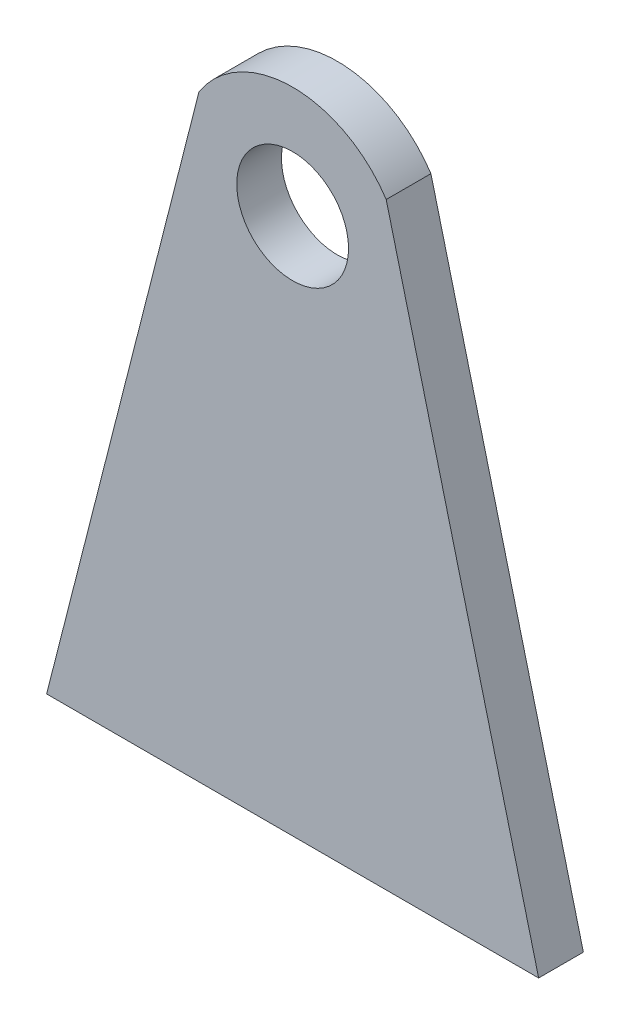
ISO-10303-21;
HEADER;
FILE_DESCRIPTION(('STEP AP214'),'2;1');
FILE_NAME('part.step','',(''),(''),'','','');
FILE_SCHEMA(('AUTOMOTIVE_DESIGN { 1 0 10303 214 1 1 1 1 }'));
ENDSEC;
DATA;
#1=APPLICATION_CONTEXT('core data for automotive mechanical design processes');
#2=APPLICATION_PROTOCOL_DEFINITION('international standard','automotive_design',2000,#1);
#3=PRODUCT_CONTEXT('',#1,'mechanical');
#4=PRODUCT('Part','Part','',(#3));
#5=PRODUCT_RELATED_PRODUCT_CATEGORY('part','',(#4));
#6=PRODUCT_DEFINITION_FORMATION('','',#4);
#7=PRODUCT_DEFINITION_CONTEXT('part definition',#1,'design');
#8=PRODUCT_DEFINITION('design','',#6,#7);
#9=PRODUCT_DEFINITION_SHAPE('','',#8);
#10=(LENGTH_UNIT() NAMED_UNIT(*) SI_UNIT(.MILLI.,.METRE.));
#11=(NAMED_UNIT(*) PLANE_ANGLE_UNIT() SI_UNIT($,.RADIAN.));
#12=(NAMED_UNIT(*) SI_UNIT($,.STERADIAN.) SOLID_ANGLE_UNIT());
#13=UNCERTAINTY_MEASURE_WITH_UNIT(LENGTH_MEASURE(1.E-05),#10,'distance_accuracy_value','');
#14=(GEOMETRIC_REPRESENTATION_CONTEXT(3) GLOBAL_UNCERTAINTY_ASSIGNED_CONTEXT((#13)) GLOBAL_UNIT_ASSIGNED_CONTEXT((#10,
#11,#12)) REPRESENTATION_CONTEXT('',''));
#15=CARTESIAN_POINT('',(0.,0.,0.));
#16=DIRECTION('',(0.,0.,1.));
#17=DIRECTION('',(1.,0.,0.));
#18=AXIS2_PLACEMENT_3D('',#15,#16,#17);
#19=CARTESIAN_POINT('',(110.,-145.,20.));
#20=DIRECTION('',(-0.969008767260909,-0.247026332546743,0.));
#21=DIRECTION('',(0.247026332546743,-0.969008767260909,0.));
#22=AXIS2_PLACEMENT_3D('',#19,#20,#21);
#23=PLANE('',#22);
#24=DIRECTION('',(-0.247026332546743,0.969008767260909,0.));
#25=VECTOR('',#24,1.);
#26=CARTESIAN_POINT('',(110.,-145.,0.));
#27=LINE('',#26,#25);
#28=CARTESIAN_POINT('',(110.,-145.,0.));
#29=VERTEX_POINT('',#28);
#30=CARTESIAN_POINT('',(41.8380805064685,122.378367729546,0.));
#31=VERTEX_POINT('',#30);
#32=EDGE_CURVE('E100',#29,#31,#27,.T.);
#33=ORIENTED_EDGE('',*,*,#32,.T.);
#34=DIRECTION('',(0.,0.,-1.));
#35=VECTOR('',#34,1.);
#36=CARTESIAN_POINT('',(41.8380805064685,122.378367729546,20.));
#37=LINE('',#36,#35);
#38=CARTESIAN_POINT('',(41.8380805064685,122.378367729546,20.));
#39=VERTEX_POINT('',#38);
#40=EDGE_CURVE('E11',#39,#31,#37,.T.);
#41=ORIENTED_EDGE('',*,*,#40,.F.);
#42=DIRECTION('',(-0.247026332546743,0.969008767260909,0.));
#43=VECTOR('',#42,1.);
#44=CARTESIAN_POINT('',(110.,-145.,20.));
#45=LINE('',#44,#43);
#46=CARTESIAN_POINT('',(110.,-145.,20.));
#47=VERTEX_POINT('',#46);
#48=EDGE_CURVE('E88',#47,#39,#45,.T.);
#49=ORIENTED_EDGE('',*,*,#48,.F.);
#50=DIRECTION('',(0.,0.,-1.));
#51=VECTOR('',#50,1.);
#52=CARTESIAN_POINT('',(110.,-145.,20.));
#53=LINE('',#52,#51);
#54=EDGE_CURVE('E96',#47,#29,#53,.T.);
#55=ORIENTED_EDGE('',*,*,#54,.T.);
#56=EDGE_LOOP('',(#33,#41,#49,#55));
#57=FACE_BOUND('',#56,.T.);
#58=ADVANCED_FACE('F37',(#57),#23,.F.);
#59=CARTESIAN_POINT('',(0.,95.,20.));
#60=DIRECTION('',(0.,0.,-1.));
#61=DIRECTION('',(-1.,0.,0.));
#62=AXIS2_PLACEMENT_3D('',#59,#60,#61);
#63=CYLINDRICAL_SURFACE('',#62,50.);
#64=CARTESIAN_POINT('',(0.,95.,0.));
#65=DIRECTION('',(0.,0.,1.));
#66=DIRECTION('',(1.,0.,0.));
#67=AXIS2_PLACEMENT_3D('',#64,#65,#66);
#68=CIRCLE('',#67,50.);
#69=CARTESIAN_POINT('',(-41.8380805064684,122.378367729546,0.));
#70=VERTEX_POINT('',#69);
#71=EDGE_CURVE('E92',#31,#70,#68,.T.);
#72=ORIENTED_EDGE('',*,*,#71,.T.);
#73=DIRECTION('',(0.,0.,-1.));
#74=VECTOR('',#73,1.);
#75=CARTESIAN_POINT('',(-41.8380805064684,122.378367729546,20.));
#76=LINE('',#75,#74);
#77=CARTESIAN_POINT('',(-41.8380805064684,122.378367729546,20.));
#78=VERTEX_POINT('',#77);
#79=EDGE_CURVE('E45',#78,#70,#76,.T.);
#80=ORIENTED_EDGE('',*,*,#79,.F.);
#81=CARTESIAN_POINT('',(0.,95.,20.));
#82=DIRECTION('',(0.,0.,1.));
#83=DIRECTION('',(1.,0.,0.));
#84=AXIS2_PLACEMENT_3D('',#81,#82,#83);
#85=CIRCLE('',#84,50.);
#86=EDGE_CURVE('E83',#39,#78,#85,.T.);
#87=ORIENTED_EDGE('',*,*,#86,.F.);
#88=ORIENTED_EDGE('',*,*,#40,.T.);
#89=EDGE_LOOP('',(#72,#80,#87,#88));
#90=FACE_BOUND('',#89,.T.);
#91=ADVANCED_FACE('F91',(#90),#63,.T.);
#92=CARTESIAN_POINT('',(-110.,-145.,20.));
#93=DIRECTION('',(0.969008767260909,-0.247026332546743,0.));
#94=DIRECTION('',(0.247026332546743,0.969008767260909,0.));
#95=AXIS2_PLACEMENT_3D('',#92,#93,#94);
#96=PLANE('',#95);
#97=DIRECTION('',(-0.247026332546743,-0.969008767260909,0.));
#98=VECTOR('',#97,1.);
#99=CARTESIAN_POINT('',(-110.,-145.,0.));
#100=LINE('',#99,#98);
#101=CARTESIAN_POINT('',(-110.,-145.,0.));
#102=VERTEX_POINT('',#101);
#103=EDGE_CURVE('E70',#70,#102,#100,.T.);
#104=ORIENTED_EDGE('',*,*,#103,.T.);
#105=DIRECTION('',(0.,0.,-1.));
#106=VECTOR('',#105,1.);
#107=CARTESIAN_POINT('',(-110.,-145.,20.));
#108=LINE('',#107,#106);
#109=CARTESIAN_POINT('',(-110.,-145.,20.));
#110=VERTEX_POINT('',#109);
#111=EDGE_CURVE('E93',#110,#102,#108,.T.);
#112=ORIENTED_EDGE('',*,*,#111,.F.);
#113=DIRECTION('',(-0.247026332546743,-0.969008767260909,0.));
#114=VECTOR('',#113,1.);
#115=CARTESIAN_POINT('',(-110.,-145.,20.));
#116=LINE('',#115,#114);
#117=EDGE_CURVE('E86',#78,#110,#116,.T.);
#118=ORIENTED_EDGE('',*,*,#117,.F.);
#119=ORIENTED_EDGE('',*,*,#79,.T.);
#120=EDGE_LOOP('',(#104,#112,#118,#119));
#121=FACE_BOUND('',#120,.T.);
#122=ADVANCED_FACE('F94',(#121),#96,.F.);
#123=CARTESIAN_POINT('',(110.,-145.,20.));
#124=DIRECTION('',(0.,1.,0.));
#125=DIRECTION('',(-1.,0.,0.));
#126=AXIS2_PLACEMENT_3D('',#123,#124,#125);
#127=PLANE('',#126);
#128=DIRECTION('',(1.,0.,0.));
#129=VECTOR('',#128,1.);
#130=CARTESIAN_POINT('',(110.,-145.,0.));
#131=LINE('',#130,#129);
#132=EDGE_CURVE('E76',#102,#29,#131,.T.);
#133=ORIENTED_EDGE('',*,*,#132,.T.);
#134=ORIENTED_EDGE('',*,*,#54,.F.);
#135=DIRECTION('',(1.,0.,0.));
#136=VECTOR('',#135,1.);
#137=CARTESIAN_POINT('',(110.,-145.,20.));
#138=LINE('',#137,#136);
#139=EDGE_CURVE('E53',#110,#47,#138,.T.);
#140=ORIENTED_EDGE('',*,*,#139,.F.);
#141=ORIENTED_EDGE('',*,*,#111,.T.);
#142=EDGE_LOOP('',(#133,#134,#140,#141));
#143=FACE_BOUND('',#142,.T.);
#144=ADVANCED_FACE('F108',(#143),#127,.F.);
#145=CARTESIAN_POINT('',(0.,95.,20.));
#146=DIRECTION('',(0.,0.,1.));
#147=DIRECTION('',(1.,0.,0.));
#148=AXIS2_PLACEMENT_3D('',#145,#146,#147);
#149=PLANE('',#148);
#150=CARTESIAN_POINT('',(0.,95.,20.));
#151=DIRECTION('',(0.,0.,1.));
#152=DIRECTION('',(1.,0.,0.));
#153=AXIS2_PLACEMENT_3D('',#150,#151,#152);
#154=CIRCLE('',#153,25.);
#155=CARTESIAN_POINT('',(25.,95.,20.));
#156=VERTEX_POINT('',#155);
#157=EDGE_CURVE('E114',#156,#156,#154,.T.);
#158=ORIENTED_EDGE('',*,*,#157,.F.);
#159=EDGE_LOOP('',(#158));
#160=FACE_BOUND('',#159,.T.);
#161=ORIENTED_EDGE('',*,*,#48,.T.);
#162=ORIENTED_EDGE('',*,*,#86,.T.);
#163=ORIENTED_EDGE('',*,*,#117,.T.);
#164=ORIENTED_EDGE('',*,*,#139,.T.);
#165=EDGE_LOOP('',(#161,#162,#163,#164));
#166=FACE_BOUND('',#165,.T.);
#167=ADVANCED_FACE('F84',(#160,#166),#149,.T.);
#168=CARTESIAN_POINT('',(0.,95.,0.));
#169=DIRECTION('',(0.,0.,1.));
#170=DIRECTION('',(1.,0.,0.));
#171=AXIS2_PLACEMENT_3D('',#168,#169,#170);
#172=PLANE('',#171);
#173=CARTESIAN_POINT('',(0.,95.,0.));
#174=DIRECTION('',(0.,0.,1.));
#175=DIRECTION('',(1.,0.,0.));
#176=AXIS2_PLACEMENT_3D('',#173,#174,#175);
#177=CIRCLE('',#176,25.);
#178=CARTESIAN_POINT('',(25.,95.,0.));
#179=VERTEX_POINT('',#178);
#180=EDGE_CURVE('E103',#179,#179,#177,.T.);
#181=ORIENTED_EDGE('',*,*,#180,.T.);
#182=EDGE_LOOP('',(#181));
#183=FACE_BOUND('',#182,.T.);
#184=ORIENTED_EDGE('',*,*,#32,.F.);
#185=ORIENTED_EDGE('',*,*,#132,.F.);
#186=ORIENTED_EDGE('',*,*,#103,.F.);
#187=ORIENTED_EDGE('',*,*,#71,.F.);
#188=EDGE_LOOP('',(#184,#185,#186,#187));
#189=FACE_BOUND('',#188,.T.);
#190=ADVANCED_FACE('F111',(#183,#189),#172,.F.);
#191=CARTESIAN_POINT('',(0.,95.,0.));
#192=DIRECTION('',(0.,0.,1.));
#193=DIRECTION('',(1.,0.,0.));
#194=AXIS2_PLACEMENT_3D('',#191,#192,#193);
#195=CYLINDRICAL_SURFACE('',#194,25.);
#196=ORIENTED_EDGE('',*,*,#180,.F.);
#197=EDGE_LOOP('',(#196));
#198=FACE_BOUND('',#197,.T.);
#199=ORIENTED_EDGE('',*,*,#157,.T.);
#200=EDGE_LOOP('',(#199));
#201=FACE_BOUND('',#200,.T.);
#202=ADVANCED_FACE('F121',(#198,#201),#195,.F.);
#203=CLOSED_SHELL('',(#58,#91,#122,#144,#167,#190,#202));
#204=MANIFOLD_SOLID_BREP('B2',#203);
#205=ADVANCED_BREP_SHAPE_REPRESENTATION('',(#18,#204),#14);
#206=SHAPE_DEFINITION_REPRESENTATION(#9,#205);
ENDSEC;
END-ISO-10303-21;
